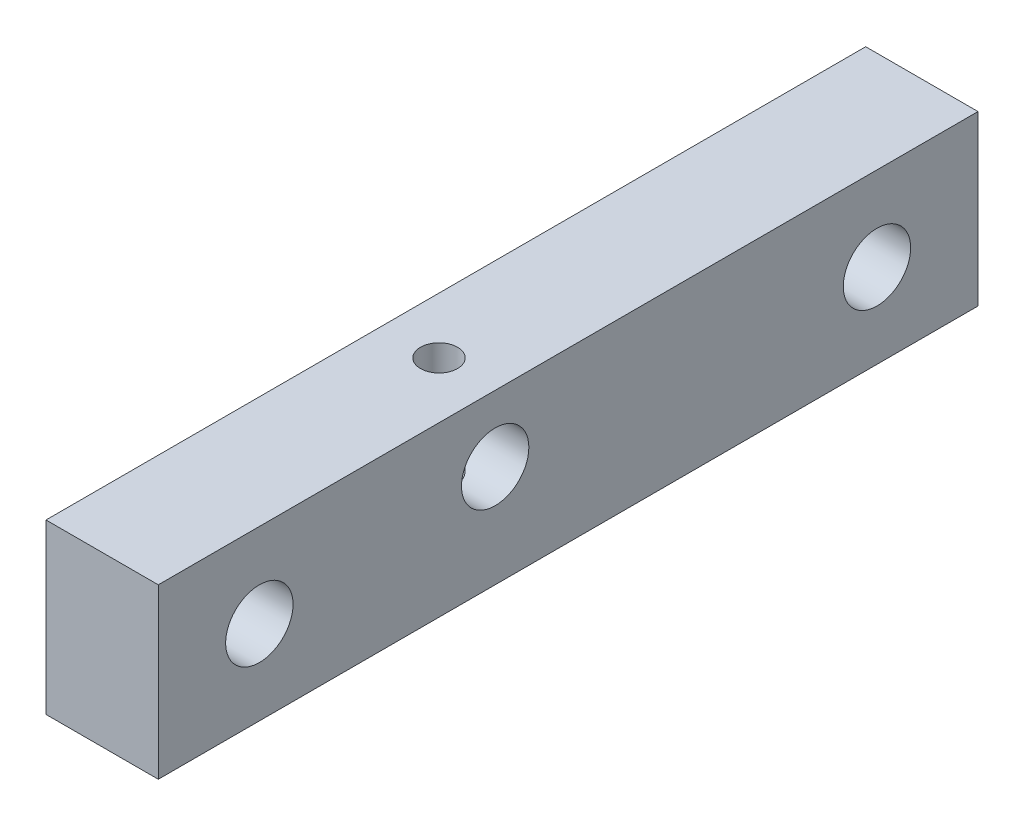
ISO-10303-21;
HEADER;
FILE_DESCRIPTION(('STEP AP214'),'2;1');
FILE_NAME('part.step','',(''),(''),'','','');
FILE_SCHEMA(('AUTOMOTIVE_DESIGN { 1 0 10303 214 1 1 1 1 }'));
ENDSEC;
DATA;
#1=APPLICATION_CONTEXT('core data for automotive mechanical design processes');
#2=APPLICATION_PROTOCOL_DEFINITION('international standard','automotive_design',2000,#1);
#3=PRODUCT_CONTEXT('',#1,'mechanical');
#4=PRODUCT('Part','Part','',(#3));
#5=PRODUCT_RELATED_PRODUCT_CATEGORY('part','',(#4));
#6=PRODUCT_DEFINITION_FORMATION('','',#4);
#7=PRODUCT_DEFINITION_CONTEXT('part definition',#1,'design');
#8=PRODUCT_DEFINITION('design','',#6,#7);
#9=PRODUCT_DEFINITION_SHAPE('','',#8);
#10=(LENGTH_UNIT() NAMED_UNIT(*) SI_UNIT(.MILLI.,.METRE.));
#11=(NAMED_UNIT(*) PLANE_ANGLE_UNIT() SI_UNIT($,.RADIAN.));
#12=(NAMED_UNIT(*) SI_UNIT($,.STERADIAN.) SOLID_ANGLE_UNIT());
#13=UNCERTAINTY_MEASURE_WITH_UNIT(LENGTH_MEASURE(1.E-05),#10,'distance_accuracy_value','');
#14=(GEOMETRIC_REPRESENTATION_CONTEXT(3) GLOBAL_UNCERTAINTY_ASSIGNED_CONTEXT((#13)) GLOBAL_UNIT_ASSIGNED_CONTEXT((#10,
#11,#12)) REPRESENTATION_CONTEXT('',''));
#15=CARTESIAN_POINT('',(0.,0.,0.));
#16=DIRECTION('',(0.,0.,1.));
#17=DIRECTION('',(1.,0.,0.));
#18=AXIS2_PLACEMENT_3D('',#15,#16,#17);
#19=CARTESIAN_POINT('',(5.,-7.5,-73.));
#20=DIRECTION('',(1.,0.,0.));
#21=DIRECTION('',(0.,0.,-1.));
#22=AXIS2_PLACEMENT_3D('',#19,#20,#21);
#23=PLANE('',#22);
#24=CARTESIAN_POINT('',(5.,1.6,-30.0000000000019));
#25=DIRECTION('',(1.,0.,0.));
#26=DIRECTION('',(0.,0.,-1.));
#27=AXIS2_PLACEMENT_3D('',#24,#25,#26);
#28=CIRCLE('',#27,2.99999999999999);
#29=CARTESIAN_POINT('',(5.,1.6,-33.0000000000019));
#30=VERTEX_POINT('',#29);
#31=EDGE_CURVE('E159',#30,#30,#28,.T.);
#32=ORIENTED_EDGE('',*,*,#31,.F.);
#33=EDGE_LOOP('',(#32));
#34=FACE_BOUND('',#33,.T.);
#35=CARTESIAN_POINT('',(5.,1.77058888384263E-11,-9.00000000000201));
#36=DIRECTION('',(1.,0.,0.));
#37=DIRECTION('',(0.,0.,-1.));
#38=AXIS2_PLACEMENT_3D('',#35,#36,#37);
#39=CIRCLE('',#38,2.99999999999999);
#40=CARTESIAN_POINT('',(5.,1.77058888384263E-11,-12.000000000002));
#41=VERTEX_POINT('',#40);
#42=EDGE_CURVE('E163',#41,#41,#39,.T.);
#43=ORIENTED_EDGE('',*,*,#42,.F.);
#44=EDGE_LOOP('',(#43));
#45=FACE_BOUND('',#44,.T.);
#46=CARTESIAN_POINT('',(5.,1.63883663584219E-11,-64.0000000000019));
#47=DIRECTION('',(1.,0.,0.));
#48=DIRECTION('',(0.,0.,-1.));
#49=AXIS2_PLACEMENT_3D('',#46,#47,#48);
#50=CIRCLE('',#49,2.99999999999999);
#51=CARTESIAN_POINT('',(5.,1.63883663584219E-11,-67.0000000000019));
#52=VERTEX_POINT('',#51);
#53=EDGE_CURVE('E166',#52,#52,#50,.T.);
#54=ORIENTED_EDGE('',*,*,#53,.F.);
#55=EDGE_LOOP('',(#54));
#56=FACE_BOUND('',#55,.T.);
#57=DIRECTION('',(0.,1.,0.));
#58=VECTOR('',#57,1.);
#59=CARTESIAN_POINT('',(5.,-7.5,0.));
#60=LINE('',#59,#58);
#61=CARTESIAN_POINT('',(5.,-7.5,0.));
#62=VERTEX_POINT('',#61);
#63=CARTESIAN_POINT('',(5.,7.5,0.));
#64=VERTEX_POINT('',#63);
#65=EDGE_CURVE('E118',#62,#64,#60,.T.);
#66=ORIENTED_EDGE('',*,*,#65,.F.);
#67=DIRECTION('',(0.,0.,1.));
#68=VECTOR('',#67,1.);
#69=CARTESIAN_POINT('',(5.,-7.5,-73.));
#70=LINE('',#69,#68);
#71=CARTESIAN_POINT('',(5.,-7.5,-73.));
#72=VERTEX_POINT('',#71);
#73=EDGE_CURVE('E13',#72,#62,#70,.T.);
#74=ORIENTED_EDGE('',*,*,#73,.F.);
#75=DIRECTION('',(0.,1.,0.));
#76=VECTOR('',#75,1.);
#77=CARTESIAN_POINT('',(5.,-7.5,-73.));
#78=LINE('',#77,#76);
#79=CARTESIAN_POINT('',(5.,7.5,-73.));
#80=VERTEX_POINT('',#79);
#81=EDGE_CURVE('E111',#72,#80,#78,.T.);
#82=ORIENTED_EDGE('',*,*,#81,.T.);
#83=DIRECTION('',(0.,0.,1.));
#84=VECTOR('',#83,1.);
#85=CARTESIAN_POINT('',(5.,7.5,-73.));
#86=LINE('',#85,#84);
#87=EDGE_CURVE('E94',#80,#64,#86,.T.);
#88=ORIENTED_EDGE('',*,*,#87,.T.);
#89=EDGE_LOOP('',(#66,#74,#82,#88));
#90=FACE_BOUND('',#89,.T.);
#91=ADVANCED_FACE('F47',(#34,#45,#56,#90),#23,.T.);
#92=CARTESIAN_POINT('',(-5.,-7.5,-73.));
#93=DIRECTION('',(0.,-1.,0.));
#94=DIRECTION('',(0.,0.,-1.));
#95=AXIS2_PLACEMENT_3D('',#92,#93,#94);
#96=PLANE('',#95);
#97=CARTESIAN_POINT('',(0.,-7.5,-30.));
#98=DIRECTION('',(0.,1.,0.));
#99=DIRECTION('',(0.,0.,1.));
#100=AXIS2_PLACEMENT_3D('',#97,#98,#99);
#101=CIRCLE('',#100,1.65);
#102=CARTESIAN_POINT('',(0.,-7.5,-28.35));
#103=VERTEX_POINT('',#102);
#104=EDGE_CURVE('E132',#103,#103,#101,.T.);
#105=ORIENTED_EDGE('',*,*,#104,.T.);
#106=EDGE_LOOP('',(#105));
#107=FACE_BOUND('',#106,.T.);
#108=DIRECTION('',(1.,0.,0.));
#109=VECTOR('',#108,1.);
#110=CARTESIAN_POINT('',(-5.,-7.5,0.));
#111=LINE('',#110,#109);
#112=CARTESIAN_POINT('',(-5.,-7.5,0.));
#113=VERTEX_POINT('',#112);
#114=EDGE_CURVE('E113',#113,#62,#111,.T.);
#115=ORIENTED_EDGE('',*,*,#114,.F.);
#116=DIRECTION('',(0.,0.,1.));
#117=VECTOR('',#116,1.);
#118=CARTESIAN_POINT('',(-5.,-7.5,-73.));
#119=LINE('',#118,#117);
#120=CARTESIAN_POINT('',(-5.,-7.5,-73.));
#121=VERTEX_POINT('',#120);
#122=EDGE_CURVE('E60',#121,#113,#119,.T.);
#123=ORIENTED_EDGE('',*,*,#122,.F.);
#124=DIRECTION('',(1.,0.,0.));
#125=VECTOR('',#124,1.);
#126=CARTESIAN_POINT('',(-5.,-7.5,-73.));
#127=LINE('',#126,#125);
#128=EDGE_CURVE('E108',#121,#72,#127,.T.);
#129=ORIENTED_EDGE('',*,*,#128,.T.);
#130=ORIENTED_EDGE('',*,*,#73,.T.);
#131=EDGE_LOOP('',(#115,#123,#129,#130));
#132=FACE_BOUND('',#131,.T.);
#133=ADVANCED_FACE('F149',(#107,#132),#96,.T.);
#134=CARTESIAN_POINT('',(-5.,-7.5,-73.));
#135=DIRECTION('',(-1.,0.,0.));
#136=DIRECTION('',(0.,0.,1.));
#137=AXIS2_PLACEMENT_3D('',#134,#135,#136);
#138=PLANE('',#137);
#139=CARTESIAN_POINT('',(-5.,1.6,-30.0000000000019));
#140=DIRECTION('',(1.,0.,0.));
#141=DIRECTION('',(0.,0.,-1.));
#142=AXIS2_PLACEMENT_3D('',#139,#140,#141);
#143=CIRCLE('',#142,3.);
#144=CARTESIAN_POINT('',(-5.,1.6,-33.0000000000019));
#145=VERTEX_POINT('',#144);
#146=EDGE_CURVE('E195',#145,#145,#143,.T.);
#147=ORIENTED_EDGE('',*,*,#146,.T.);
#148=EDGE_LOOP('',(#147));
#149=FACE_BOUND('',#148,.T.);
#150=CARTESIAN_POINT('',(-5.,1.77058888384263E-11,-9.00000000000201));
#151=DIRECTION('',(1.,0.,0.));
#152=DIRECTION('',(0.,0.,-1.));
#153=AXIS2_PLACEMENT_3D('',#150,#151,#152);
#154=CIRCLE('',#153,3.);
#155=CARTESIAN_POINT('',(-5.,1.77058888384263E-11,-12.000000000002));
#156=VERTEX_POINT('',#155);
#157=EDGE_CURVE('E199',#156,#156,#154,.T.);
#158=ORIENTED_EDGE('',*,*,#157,.T.);
#159=EDGE_LOOP('',(#158));
#160=FACE_BOUND('',#159,.T.);
#161=CARTESIAN_POINT('',(-5.,1.63883663584219E-11,-64.0000000000019));
#162=DIRECTION('',(1.,0.,0.));
#163=DIRECTION('',(0.,0.,-1.));
#164=AXIS2_PLACEMENT_3D('',#161,#162,#163);
#165=CIRCLE('',#164,3.);
#166=CARTESIAN_POINT('',(-5.,1.63883663584219E-11,-67.0000000000019));
#167=VERTEX_POINT('',#166);
#168=EDGE_CURVE('E122',#167,#167,#165,.T.);
#169=ORIENTED_EDGE('',*,*,#168,.T.);
#170=EDGE_LOOP('',(#169));
#171=FACE_BOUND('',#170,.T.);
#172=DIRECTION('',(0.,-1.,0.));
#173=VECTOR('',#172,1.);
#174=CARTESIAN_POINT('',(-5.,-7.5,0.));
#175=LINE('',#174,#173);
#176=CARTESIAN_POINT('',(-5.,7.5,0.));
#177=VERTEX_POINT('',#176);
#178=EDGE_CURVE('E102',#177,#113,#175,.T.);
#179=ORIENTED_EDGE('',*,*,#178,.F.);
#180=DIRECTION('',(0.,0.,1.));
#181=VECTOR('',#180,1.);
#182=CARTESIAN_POINT('',(-5.,7.5,-73.));
#183=LINE('',#182,#181);
#184=CARTESIAN_POINT('',(-5.,7.5,-73.));
#185=VERTEX_POINT('',#184);
#186=EDGE_CURVE('E97',#185,#177,#183,.T.);
#187=ORIENTED_EDGE('',*,*,#186,.F.);
#188=DIRECTION('',(0.,-1.,0.));
#189=VECTOR('',#188,1.);
#190=CARTESIAN_POINT('',(-5.,-7.5,-73.));
#191=LINE('',#190,#189);
#192=EDGE_CURVE('E100',#185,#121,#191,.T.);
#193=ORIENTED_EDGE('',*,*,#192,.T.);
#194=ORIENTED_EDGE('',*,*,#122,.T.);
#195=EDGE_LOOP('',(#179,#187,#193,#194));
#196=FACE_BOUND('',#195,.T.);
#197=ADVANCED_FACE('F99',(#149,#160,#171,#196),#138,.T.);
#198=CARTESIAN_POINT('',(-5.,7.5,-73.));
#199=DIRECTION('',(0.,1.,0.));
#200=DIRECTION('',(0.,0.,1.));
#201=AXIS2_PLACEMENT_3D('',#198,#199,#200);
#202=PLANE('',#201);
#203=CARTESIAN_POINT('',(0.,7.5,-30.));
#204=DIRECTION('',(0.,1.,0.));
#205=DIRECTION('',(0.,0.,1.));
#206=AXIS2_PLACEMENT_3D('',#203,#204,#205);
#207=CIRCLE('',#206,1.64999999999999);
#208=CARTESIAN_POINT('',(0.,7.5,-28.35));
#209=VERTEX_POINT('',#208);
#210=EDGE_CURVE('E189',#209,#209,#207,.T.);
#211=ORIENTED_EDGE('',*,*,#210,.F.);
#212=EDGE_LOOP('',(#211));
#213=FACE_BOUND('',#212,.T.);
#214=DIRECTION('',(-1.,0.,0.));
#215=VECTOR('',#214,1.);
#216=CARTESIAN_POINT('',(-5.,7.5,0.));
#217=LINE('',#216,#215);
#218=EDGE_CURVE('E121',#64,#177,#217,.T.);
#219=ORIENTED_EDGE('',*,*,#218,.F.);
#220=ORIENTED_EDGE('',*,*,#87,.F.);
#221=DIRECTION('',(-1.,0.,0.));
#222=VECTOR('',#221,1.);
#223=CARTESIAN_POINT('',(-5.,7.5,-73.));
#224=LINE('',#223,#222);
#225=EDGE_CURVE('E107',#80,#185,#224,.T.);
#226=ORIENTED_EDGE('',*,*,#225,.T.);
#227=ORIENTED_EDGE('',*,*,#186,.T.);
#228=EDGE_LOOP('',(#219,#220,#226,#227));
#229=FACE_BOUND('',#228,.T.);
#230=ADVANCED_FACE('F110',(#213,#229),#202,.T.);
#231=CARTESIAN_POINT('',(0.,0.,-73.));
#232=DIRECTION('',(0.,0.,-1.));
#233=DIRECTION('',(-1.,0.,0.));
#234=AXIS2_PLACEMENT_3D('',#231,#232,#233);
#235=PLANE('',#234);
#236=ORIENTED_EDGE('',*,*,#81,.F.);
#237=ORIENTED_EDGE('',*,*,#128,.F.);
#238=ORIENTED_EDGE('',*,*,#192,.F.);
#239=ORIENTED_EDGE('',*,*,#225,.F.);
#240=EDGE_LOOP('',(#236,#237,#238,#239));
#241=FACE_BOUND('',#240,.T.);
#242=ADVANCED_FACE('F106',(#241),#235,.T.);
#243=CARTESIAN_POINT('',(0.,0.,0.));
#244=DIRECTION('',(0.,0.,-1.));
#245=DIRECTION('',(-1.,0.,0.));
#246=AXIS2_PLACEMENT_3D('',#243,#244,#245);
#247=PLANE('',#246);
#248=ORIENTED_EDGE('',*,*,#65,.T.);
#249=ORIENTED_EDGE('',*,*,#218,.T.);
#250=ORIENTED_EDGE('',*,*,#178,.T.);
#251=ORIENTED_EDGE('',*,*,#114,.T.);
#252=EDGE_LOOP('',(#248,#249,#250,#251));
#253=FACE_BOUND('',#252,.T.);
#254=ADVANCED_FACE('F168',(#253),#247,.F.);
#255=CARTESIAN_POINT('',(5.,1.63883663584219E-11,-64.0000000000019));
#256=DIRECTION('',(1.,0.,0.));
#257=DIRECTION('',(0.,0.,-1.));
#258=AXIS2_PLACEMENT_3D('',#255,#256,#257);
#259=CYLINDRICAL_SURFACE('',#258,2.99999999999999);
#260=ORIENTED_EDGE('',*,*,#168,.F.);
#261=EDGE_LOOP('',(#260));
#262=FACE_BOUND('',#261,.T.);
#263=ORIENTED_EDGE('',*,*,#53,.T.);
#264=EDGE_LOOP('',(#263));
#265=FACE_BOUND('',#264,.T.);
#266=ADVANCED_FACE('F170',(#262,#265),#259,.F.);
#267=CARTESIAN_POINT('',(5.,1.77058888384263E-11,-9.00000000000201));
#268=DIRECTION('',(1.,0.,0.));
#269=DIRECTION('',(0.,0.,-1.));
#270=AXIS2_PLACEMENT_3D('',#267,#268,#269);
#271=CYLINDRICAL_SURFACE('',#270,2.99999999999999);
#272=ORIENTED_EDGE('',*,*,#157,.F.);
#273=EDGE_LOOP('',(#272));
#274=FACE_BOUND('',#273,.T.);
#275=ORIENTED_EDGE('',*,*,#42,.T.);
#276=EDGE_LOOP('',(#275));
#277=FACE_BOUND('',#276,.T.);
#278=ADVANCED_FACE('F176',(#274,#277),#271,.F.);
#279=CARTESIAN_POINT('',(5.,1.6,-30.0000000000019));
#280=DIRECTION('',(1.,0.,0.));
#281=DIRECTION('',(0.,0.,-1.));
#282=AXIS2_PLACEMENT_3D('',#279,#280,#281);
#283=CYLINDRICAL_SURFACE('',#282,2.99999999999999);
#284=CARTESIAN_POINT('',(0.,-0.905493963272247,-28.35));
#285=CARTESIAN_POINT('',(-0.084562244124193,-0.905502907290188,-28.3500064188449));
#286=CARTESIAN_POINT('',(-0.169198419643702,-0.909842783045074,-28.3565458790449));
#287=CARTESIAN_POINT('',(-0.335758010656013,-0.926523054719694,-28.3823164220387));
#288=CARTESIAN_POINT('',(-0.417676607736972,-0.93887693813217,-28.4015689016948));
#289=CARTESIAN_POINT('',(-0.576058158341485,-0.969695144239413,-28.4516086649587));
#290=CARTESIAN_POINT('',(-0.652551663639598,-0.988121282536503,-28.4823240220548));
#291=CARTESIAN_POINT('',(-0.799270749323033,-1.02894573960591,-28.5541963197267));
#292=CARTESIAN_POINT('',(-0.869495019378517,-1.05134488586629,-28.5953554362728));
#293=CARTESIAN_POINT('',(-1.00949302048582,-1.10034227169382,-28.6918101244788));
#294=CARTESIAN_POINT('',(-1.07850385692007,-1.12713610292744,-28.7481140243145));
#295=CARTESIAN_POINT('',(-1.20671542475588,-1.18033402122239,-28.871177501349));
#296=CARTESIAN_POINT('',(-1.26591027944535,-1.20673786624945,-28.9379432957769));
#297=CARTESIAN_POINT('',(-1.37781278752472,-1.25888255333883,-29.0870159611973));
#298=CARTESIAN_POINT('',(-1.42952708912541,-1.28437182872262,-29.1701649906734));
#299=CARTESIAN_POINT('',(-1.51787790618017,-1.32916377464728,-29.3456504436017));
#300=CARTESIAN_POINT('',(-1.55452591089563,-1.34847115688372,-29.43797979934));
#301=CARTESIAN_POINT('',(-1.60849398479955,-1.37729382330362,-29.6210771456565));
#302=CARTESIAN_POINT('',(-1.6271681432719,-1.38749000620533,-29.7113362378114));
#303=CARTESIAN_POINT('',(-1.64917477835192,-1.3995312021752,-29.8942311510278));
#304=CARTESIAN_POINT('',(-1.65251888599857,-1.40138254652494,-29.9868651165725));
#305=CARTESIAN_POINT('',(-1.64415987626311,-1.39679126383718,-30.1614569427432));
#306=CARTESIAN_POINT('',(-1.63399569896198,-1.39119680588279,-30.2435170360423));
#307=CARTESIAN_POINT('',(-1.60174386066675,-1.37370139090664,-30.4045489347136));
#308=CARTESIAN_POINT('',(-1.57965528402607,-1.36179994958775,-30.4835205024257));
#309=CARTESIAN_POINT('',(-1.52418240454991,-1.33258792133327,-30.6372794297863));
#310=CARTESIAN_POINT('',(-1.49067904874514,-1.31522047737597,-30.7120125870654));
#311=CARTESIAN_POINT('',(-1.41356855385778,-1.27655421939474,-30.8549417413053));
#312=CARTESIAN_POINT('',(-1.36995818281498,-1.25525414826307,-30.9231356372981));
#313=CARTESIAN_POINT('',(-1.26851524995852,-1.20791814382512,-31.0589171719185));
#314=CARTESIAN_POINT('',(-1.20965606912745,-1.18161920172614,-31.1256461719558));
#315=CARTESIAN_POINT('',(-1.08207579455034,-1.1285563799987,-31.2487937798383));
#316=CARTESIAN_POINT('',(-1.01334455874163,-1.10179204741483,-31.3052016470545));
#317=CARTESIAN_POINT('',(-0.860702045770714,-1.04816260741485,-31.4110475714708));
#318=CARTESIAN_POINT('',(-0.775987825023658,-1.0214949355764,-31.4594389808458));
#319=CARTESIAN_POINT('',(-0.597912341244523,-0.974426694549308,-31.5409607244019));
#320=CARTESIAN_POINT('',(-0.504561226105141,-0.95401888906755,-31.5741087020227));
#321=CARTESIAN_POINT('',(-0.319617566086233,-0.924288688854981,-31.6213248074759));
#322=CARTESIAN_POINT('',(-0.228492292819119,-0.91420388175881,-31.6367180814907));
#323=CARTESIAN_POINT('',(-0.0444385673957204,-0.904211322840576,-31.651976005483));
#324=CARTESIAN_POINT('',(0.0484877010049397,-0.904291933286797,-31.6518584128455));
#325=CARTESIAN_POINT('',(0.218980696775316,-0.913812916359035,-31.6373106699758));
#326=CARTESIAN_POINT('',(0.296816762788014,-0.921891182808935,-31.6249632757909));
#327=CARTESIAN_POINT('',(0.449094842708316,-0.944308983163447,-31.5896309254529));
#328=CARTESIAN_POINT('',(0.523535351197178,-0.95865126498293,-31.5666413004723));
#329=CARTESIAN_POINT('',(0.670568414340717,-0.992647010530739,-31.5097408753415));
#330=CARTESIAN_POINT('',(0.742950820695087,-1.01249886195963,-31.4754105867172));
#331=CARTESIAN_POINT('',(0.881361532983086,-1.05517525628284,-31.3971508807438));
#332=CARTESIAN_POINT('',(0.947386671982717,-1.07800126759616,-31.3532167144045));
#333=CARTESIAN_POINT('',(1.0821759828332,-1.12838745980352,-31.2489038472852));
#334=CARTESIAN_POINT('',(1.14971665545379,-1.15612471210631,-31.1870225603483));
#335=CARTESIAN_POINT('',(1.27394463458259,-1.21021466477366,-31.0525903424805));
#336=CARTESIAN_POINT('',(1.33062557660609,-1.23656654670024,-30.9800331985932));
#337=CARTESIAN_POINT('',(1.43418356477845,-1.28655886174403,-30.8215914320174));
#338=CARTESIAN_POINT('',(1.48041980778183,-1.30999476284938,-30.7352183644952));
#339=CARTESIAN_POINT('',(1.55721430537592,-1.34980224898667,-30.5542695361801));
#340=CARTESIAN_POINT('',(1.58778886056157,-1.36618117604324,-30.4597024240852));
#341=CARTESIAN_POINT('',(1.62930611839184,-1.38862325067993,-30.2754177979954));
#342=CARTESIAN_POINT('',(1.64193096934435,-1.3955670543244,-30.1861871294253));
#343=CARTESIAN_POINT('',(1.65243189343454,-1.40133436858647,-30.0066167630888));
#344=CARTESIAN_POINT('',(1.65031573581961,-1.40016215675136,-29.9162776745749));
#345=CARTESIAN_POINT('',(1.63233007153813,-1.39031042427508,-29.745641633703));
#346=CARTESIAN_POINT('',(1.61770633320567,-1.38231104671807,-29.6651686369522));
#347=CARTESIAN_POINT('',(1.57703517800954,-1.36044701025348,-29.5080141661232));
#348=CARTESIAN_POINT('',(1.55098639804468,-1.34658165149322,-29.4313331456739));
#349=CARTESIAN_POINT('',(1.48738736796042,-1.31359875185397,-29.280919720519));
#350=CARTESIAN_POINT('',(1.44947440595502,-1.29431787940881,-29.2073777037947));
#351=CARTESIAN_POINT('',(1.36367449851237,-1.25231650614728,-29.0674575947306));
#352=CARTESIAN_POINT('',(1.31578351940053,-1.22959461529589,-29.0010824161554));
#353=CARTESIAN_POINT('',(1.20507399834967,-1.17974517124939,-28.8692778937083));
#354=CARTESIAN_POINT('',(1.14117216627437,-1.15241145940732,-28.8048350439416));
#355=CARTESIAN_POINT('',(1.00349286244811,-1.09823878536962,-28.6870955929718));
#356=CARTESIAN_POINT('',(0.92970353472667,-1.07140046184064,-28.6338125730863));
#357=CARTESIAN_POINT('',(0.76827599994855,-1.01945108088823,-28.5365403765574));
#358=CARTESIAN_POINT('',(0.680043601407319,-0.994572990894916,-28.4934030725197));
#359=CARTESIAN_POINT('',(0.495821199591245,-0.952528855841646,-28.4231990673064));
#360=CARTESIAN_POINT('',(0.399857047171731,-0.935338275366342,-28.3960811484984));
#361=CARTESIAN_POINT('',(0.252191216941432,-0.917669254130844,-28.3686051340391));
#362=CARTESIAN_POINT('',(0.202125235839947,-0.913130626130162,-28.3616455595007));
#363=CARTESIAN_POINT('',(0.101381687592477,-0.907040332363386,-28.3523411192439));
#364=CARTESIAN_POINT('',(0.0507041340308379,-0.905488600374311,-28.3499961512141));
#365=CARTESIAN_POINT('',(0.,-0.905493963272247,-28.35));
#366=B_SPLINE_CURVE_WITH_KNOTS('',3,(#284,#285,#286,#287,#288,#289,#290,#291,#292,#293,#294,
#295,#296,#297,#298,#299,#300,#301,#302,#303,#304,#305,#306,#307,#308,#309,#310,#311,#312,#313,
#314,#315,#316,#317,#318,#319,#320,#321,#322,#323,#324,#325,#326,#327,#328,#329,#330,#331,#332,
#333,#334,#335,#336,#337,#338,#339,#340,#341,#342,#343,#344,#345,#346,#347,#348,#349,#350,#351,
#352,#353,#354,#355,#356,#357,#358,#359,#360,#361,#362,#363,#364,#365),.UNSPECIFIED.,.T.,.F.,(4,
2,2,2,2,2,2,2,2,2,2,2,2,2,2,2,2,2,2,2,2,2,2,2,2,2,2,2,2,2,2,2,2,2,2,2,2,2,2,2,4),(0.,
0.253471464978847,0.507370630471825,0.759702723718207,1.01208743389962,1.28998079678294,
1.56803993512347,1.86997289364896,2.17167517502762,2.44828286528193,2.72468065617506,
2.97213663093991,3.21961160997042,3.46975098230548,3.71997045333211,3.99717687977861,
4.27467015892944,4.57652503396545,4.87802964361029,5.15517475627433,5.43200258623552,
5.66859462056192,5.90529054812095,6.15196333618111,6.39875837770534,6.6846559935314,
6.97072065421042,7.27125286686228,7.57147164850519,7.84111747203309,8.11062118950799,
8.35604451303921,8.60149712555463,8.85533990697375,9.10928550569648,9.3924334600643,
9.67592402360678,9.97823556729933,10.2795752459722,10.431561941938,10.5835452681421),.UNSPECIFIED.);
#367=CARTESIAN_POINT('',(0.,-0.905493963272247,-28.35));
#368=VERTEX_POINT('',#367);
#369=EDGE_CURVE('E50',#368,#368,#366,.T.);
#370=ORIENTED_EDGE('',*,*,#369,.T.);
#371=EDGE_LOOP('',(#370));
#372=FACE_BOUND('',#371,.T.);
#373=CARTESIAN_POINT('',(0.,4.10549396327224,-28.35));
#374=CARTESIAN_POINT('',(0.0845622441241929,4.10550290729018,-28.3500064188449));
#375=CARTESIAN_POINT('',(0.169198419643702,4.10984278304507,-28.3565458790449));
#376=CARTESIAN_POINT('',(0.335758010656013,4.12652305471969,-28.3823164220387));
#377=CARTESIAN_POINT('',(0.417676607736972,4.13887693813217,-28.4015689016948));
#378=CARTESIAN_POINT('',(0.576058158341485,4.16969514423941,-28.4516086649587));
#379=CARTESIAN_POINT('',(0.652551663639598,4.1881212825365,-28.4823240220548));
#380=CARTESIAN_POINT('',(0.799270749323033,4.22894573960591,-28.5541963197267));
#381=CARTESIAN_POINT('',(0.869495019378517,4.25134488586629,-28.5953554362728));
#382=CARTESIAN_POINT('',(1.00949302048582,4.30034227169382,-28.6918101244788));
#383=CARTESIAN_POINT('',(1.07850385692007,4.32713610292743,-28.7481140243145));
#384=CARTESIAN_POINT('',(1.20671542475588,4.38033402122239,-28.871177501349));
#385=CARTESIAN_POINT('',(1.26591027944535,4.40673786624944,-28.9379432957769));
#386=CARTESIAN_POINT('',(1.37781278752472,4.45888255333883,-29.0870159611973));
#387=CARTESIAN_POINT('',(1.42952708912541,4.48437182872262,-29.1701649906734));
#388=CARTESIAN_POINT('',(1.51787790618017,4.52916377464728,-29.3456504436017));
#389=CARTESIAN_POINT('',(1.55452591089563,4.54847115688372,-29.43797979934));
#390=CARTESIAN_POINT('',(1.60849398479955,4.57729382330361,-29.6210771456565));
#391=CARTESIAN_POINT('',(1.6271681432719,4.58749000620533,-29.7113362378114));
#392=CARTESIAN_POINT('',(1.64917477835192,4.5995312021752,-29.8942311510278));
#393=CARTESIAN_POINT('',(1.65251888599857,4.60138254652494,-29.9868651165725));
#394=CARTESIAN_POINT('',(1.64415987626311,4.59679126383718,-30.1614569427432));
#395=CARTESIAN_POINT('',(1.63399569896198,4.59119680588278,-30.2435170360423));
#396=CARTESIAN_POINT('',(1.60174386066675,4.57370139090663,-30.4045489347136));
#397=CARTESIAN_POINT('',(1.57965528402607,4.56179994958775,-30.4835205024257));
#398=CARTESIAN_POINT('',(1.52418240454991,4.53258792133326,-30.6372794297863));
#399=CARTESIAN_POINT('',(1.49067904874514,4.51522047737596,-30.7120125870654));
#400=CARTESIAN_POINT('',(1.41356855385778,4.47655421939474,-30.8549417413053));
#401=CARTESIAN_POINT('',(1.36995818281498,4.45525414826307,-30.9231356372981));
#402=CARTESIAN_POINT('',(1.26851524995852,4.40791814382511,-31.0589171719185));
#403=CARTESIAN_POINT('',(1.20965606912745,4.38161920172614,-31.1256461719558));
#404=CARTESIAN_POINT('',(1.08207579455034,4.3285563799987,-31.2487937798383));
#405=CARTESIAN_POINT('',(1.01334455874163,4.30179204741482,-31.3052016470545));
#406=CARTESIAN_POINT('',(0.860702045770714,4.24816260741485,-31.4110475714708));
#407=CARTESIAN_POINT('',(0.775987825023658,4.22149493557639,-31.4594389808458));
#408=CARTESIAN_POINT('',(0.597912341244523,4.1744266945493,-31.5409607244019));
#409=CARTESIAN_POINT('',(0.504561226105141,4.15401888906755,-31.5741087020227));
#410=CARTESIAN_POINT('',(0.319617566086233,4.12428868885498,-31.6213248074759));
#411=CARTESIAN_POINT('',(0.228492292819119,4.11420388175881,-31.6367180814907));
#412=CARTESIAN_POINT('',(0.0444385673957201,4.10421132284057,-31.651976005483));
#413=CARTESIAN_POINT('',(-0.0484877010049401,4.10429193328679,-31.6518584128455));
#414=CARTESIAN_POINT('',(-0.218980696775316,4.11381291635903,-31.6373106699758));
#415=CARTESIAN_POINT('',(-0.296816762788015,4.12189118280893,-31.6249632757909));
#416=CARTESIAN_POINT('',(-0.449094842708317,4.14430898316344,-31.5896309254529));
#417=CARTESIAN_POINT('',(-0.523535351197179,4.15865126498293,-31.5666413004723));
#418=CARTESIAN_POINT('',(-0.670568414340717,4.19264701053073,-31.5097408753415));
#419=CARTESIAN_POINT('',(-0.742950820695088,4.21249886195962,-31.4754105867172));
#420=CARTESIAN_POINT('',(-0.881361532983087,4.25517525628284,-31.3971508807438));
#421=CARTESIAN_POINT('',(-0.947386671982717,4.27800126759616,-31.3532167144045));
#422=CARTESIAN_POINT('',(-1.0821759828332,4.32838745980352,-31.2489038472852));
#423=CARTESIAN_POINT('',(-1.14971665545379,4.3561247121063,-31.1870225603483));
#424=CARTESIAN_POINT('',(-1.27394463458259,4.41021466477365,-31.0525903424805));
#425=CARTESIAN_POINT('',(-1.33062557660609,4.43656654670023,-30.9800331985932));
#426=CARTESIAN_POINT('',(-1.43418356477845,4.48655886174403,-30.8215914320174));
#427=CARTESIAN_POINT('',(-1.48041980778183,4.50999476284938,-30.7352183644952));
#428=CARTESIAN_POINT('',(-1.55721430537592,4.54980224898667,-30.5542695361801));
#429=CARTESIAN_POINT('',(-1.58778886056157,4.56618117604323,-30.4597024240852));
#430=CARTESIAN_POINT('',(-1.62930611839184,4.58862325067993,-30.2754177979954));
#431=CARTESIAN_POINT('',(-1.64193096934435,4.59556705432439,-30.1861871294253));
#432=CARTESIAN_POINT('',(-1.65243189343454,4.60133436858646,-30.0066167630888));
#433=CARTESIAN_POINT('',(-1.65031573581961,4.60016215675135,-29.9162776745749));
#434=CARTESIAN_POINT('',(-1.63233007153813,4.59031042427507,-29.745641633703));
#435=CARTESIAN_POINT('',(-1.61770633320567,4.58231104671807,-29.6651686369522));
#436=CARTESIAN_POINT('',(-1.57703517800954,4.56044701025348,-29.5080141661232));
#437=CARTESIAN_POINT('',(-1.55098639804468,4.54658165149322,-29.4313331456739));
#438=CARTESIAN_POINT('',(-1.48738736796042,4.51359875185397,-29.280919720519));
#439=CARTESIAN_POINT('',(-1.44947440595502,4.49431787940881,-29.2073777037947));
#440=CARTESIAN_POINT('',(-1.36367449851237,4.45231650614727,-29.0674575947306));
#441=CARTESIAN_POINT('',(-1.31578351940053,4.42959461529589,-29.0010824161554));
#442=CARTESIAN_POINT('',(-1.20507399834967,4.37974517124939,-28.8692778937083));
#443=CARTESIAN_POINT('',(-1.14117216627437,4.35241145940732,-28.8048350439416));
#444=CARTESIAN_POINT('',(-1.00349286244811,4.29823878536962,-28.6870955929718));
#445=CARTESIAN_POINT('',(-0.92970353472667,4.27140046184064,-28.6338125730863));
#446=CARTESIAN_POINT('',(-0.768275999948551,4.21945108088823,-28.5365403765574));
#447=CARTESIAN_POINT('',(-0.680043601407319,4.19457299089491,-28.4934030725197));
#448=CARTESIAN_POINT('',(-0.495821199591246,4.15252885584164,-28.4231990673064));
#449=CARTESIAN_POINT('',(-0.399857047171731,4.13533827536634,-28.3960811484984));
#450=CARTESIAN_POINT('',(-0.252191216941432,4.11766925413084,-28.3686051340391));
#451=CARTESIAN_POINT('',(-0.202125235839947,4.11313062613016,-28.3616455595007));
#452=CARTESIAN_POINT('',(-0.101381687592477,4.10704033236338,-28.3523411192439));
#453=CARTESIAN_POINT('',(-0.0507041340308379,4.10548860037431,-28.3499961512141));
#454=CARTESIAN_POINT('',(0.,4.10549396327224,-28.35));
#455=B_SPLINE_CURVE_WITH_KNOTS('',3,(#373,#374,#375,#376,#377,#378,#379,#380,#381,#382,#383,
#384,#385,#386,#387,#388,#389,#390,#391,#392,#393,#394,#395,#396,#397,#398,#399,#400,#401,#402,
#403,#404,#405,#406,#407,#408,#409,#410,#411,#412,#413,#414,#415,#416,#417,#418,#419,#420,#421,
#422,#423,#424,#425,#426,#427,#428,#429,#430,#431,#432,#433,#434,#435,#436,#437,#438,#439,#440,
#441,#442,#443,#444,#445,#446,#447,#448,#449,#450,#451,#452,#453,#454),.UNSPECIFIED.,.T.,.F.,(4,
2,2,2,2,2,2,2,2,2,2,2,2,2,2,2,2,2,2,2,2,2,2,2,2,2,2,2,2,2,2,2,2,2,2,2,2,2,2,2,4),(0.,
0.253471464978847,0.507370630471825,0.759702723718207,1.01208743389962,1.28998079678294,
1.56803993512347,1.86997289364896,2.17167517502762,2.44828286528193,2.72468065617506,
2.97213663093991,3.21961160997042,3.46975098230548,3.71997045333211,3.99717687977861,
4.27467015892944,4.57652503396545,4.87802964361029,5.15517475627433,5.43200258623552,
5.66859462056192,5.90529054812095,6.15196333618111,6.39875837770534,6.6846559935314,
6.97072065421042,7.27125286686229,7.5714716485052,7.84111747203309,8.11062118950798,
8.3560445130392,8.60149712555464,8.85533990697375,9.10928550569649,9.3924334600643,
9.67592402360678,9.97823556729933,10.2795752459722,10.431561941938,10.5835452681421),.UNSPECIFIED.);
#456=CARTESIAN_POINT('',(0.,4.10549396327224,-28.35));
#457=VERTEX_POINT('',#456);
#458=EDGE_CURVE('E128',#457,#457,#455,.T.);
#459=ORIENTED_EDGE('',*,*,#458,.T.);
#460=EDGE_LOOP('',(#459));
#461=FACE_BOUND('',#460,.T.);
#462=ORIENTED_EDGE('',*,*,#146,.F.);
#463=EDGE_LOOP('',(#462));
#464=FACE_BOUND('',#463,.T.);
#465=ORIENTED_EDGE('',*,*,#31,.T.);
#466=EDGE_LOOP('',(#465));
#467=FACE_BOUND('',#466,.T.);
#468=ADVANCED_FACE('F133',(#372,#461,#464,#467),#283,.F.);
#469=CARTESIAN_POINT('',(0.,7.5,-30.));
#470=DIRECTION('',(0.,1.,0.));
#471=DIRECTION('',(0.,0.,1.));
#472=AXIS2_PLACEMENT_3D('',#469,#470,#471);
#473=CYLINDRICAL_SURFACE('',#472,1.64999999999999);
#474=ORIENTED_EDGE('',*,*,#210,.T.);
#475=EDGE_LOOP('',(#474));
#476=FACE_BOUND('',#475,.T.);
#477=ORIENTED_EDGE('',*,*,#458,.F.);
#478=EDGE_LOOP('',(#477));
#479=FACE_BOUND('',#478,.T.);
#480=ADVANCED_FACE('F139',(#476,#479),#473,.F.);
#481=ORIENTED_EDGE('',*,*,#104,.F.);
#482=EDGE_LOOP('',(#481));
#483=FACE_BOUND('',#482,.T.);
#484=ORIENTED_EDGE('',*,*,#369,.F.);
#485=EDGE_LOOP('',(#484));
#486=FACE_BOUND('',#485,.T.);
#487=ADVANCED_FACE('F136',(#483,#486),#473,.F.);
#488=CLOSED_SHELL('',(#91,#133,#197,#230,#242,#254,#266,#278,#468,#480,#487));
#489=MANIFOLD_SOLID_BREP('B2',#488);
#490=ADVANCED_BREP_SHAPE_REPRESENTATION('',(#18,#489),#14);
#491=SHAPE_DEFINITION_REPRESENTATION(#9,#490);
ENDSEC;
END-ISO-10303-21;
